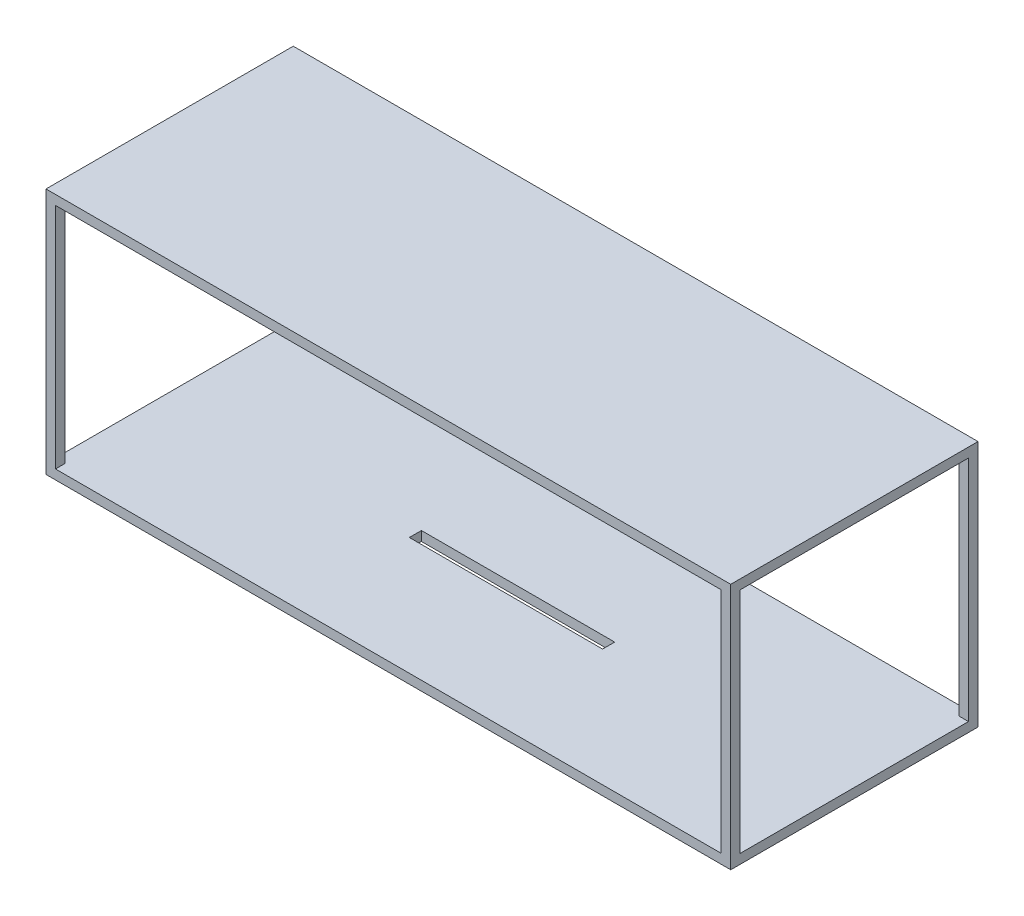
ISO-10303-21;
HEADER;
FILE_DESCRIPTION(('STEP AP214'),'2;1');
FILE_NAME('part.step','',(''),(''),'','','');
FILE_SCHEMA(('AUTOMOTIVE_DESIGN { 1 0 10303 214 1 1 1 1 }'));
ENDSEC;
DATA;
#1=APPLICATION_CONTEXT('core data for automotive mechanical design processes');
#2=APPLICATION_PROTOCOL_DEFINITION('international standard','automotive_design',2000,#1);
#3=PRODUCT_CONTEXT('',#1,'mechanical');
#4=PRODUCT('Part','Part','',(#3));
#5=PRODUCT_RELATED_PRODUCT_CATEGORY('part','',(#4));
#6=PRODUCT_DEFINITION_FORMATION('','',#4);
#7=PRODUCT_DEFINITION_CONTEXT('part definition',#1,'design');
#8=PRODUCT_DEFINITION('design','',#6,#7);
#9=PRODUCT_DEFINITION_SHAPE('','',#8);
#10=(LENGTH_UNIT() NAMED_UNIT(*) SI_UNIT(.MILLI.,.METRE.));
#11=(NAMED_UNIT(*) PLANE_ANGLE_UNIT() SI_UNIT($,.RADIAN.));
#12=(NAMED_UNIT(*) SI_UNIT($,.STERADIAN.) SOLID_ANGLE_UNIT());
#13=UNCERTAINTY_MEASURE_WITH_UNIT(LENGTH_MEASURE(1.E-05),#10,'distance_accuracy_value','');
#14=(GEOMETRIC_REPRESENTATION_CONTEXT(3) GLOBAL_UNCERTAINTY_ASSIGNED_CONTEXT((#13)) GLOBAL_UNIT_ASSIGNED_CONTEXT((#10,
#11,#12)) REPRESENTATION_CONTEXT('',''));
#15=CARTESIAN_POINT('',(0.,0.,0.));
#16=DIRECTION('',(0.,0.,1.));
#17=DIRECTION('',(1.,0.,0.));
#18=AXIS2_PLACEMENT_3D('',#15,#16,#17);
#19=CARTESIAN_POINT('',(0.,0.,125.));
#20=DIRECTION('',(0.,0.,1.));
#21=DIRECTION('',(1.,0.,0.));
#22=AXIS2_PLACEMENT_3D('',#19,#20,#21);
#23=PLANE('',#22);
#24=DIRECTION('',(1.,0.,0.));
#25=VECTOR('',#24,1.);
#26=CARTESIAN_POINT('',(-180.,-60.,125.));
#27=LINE('',#26,#25);
#28=CARTESIAN_POINT('',(175.,-60.,125.));
#29=VERTEX_POINT('',#28);
#30=CARTESIAN_POINT('',(180.,-60.,125.));
#31=VERTEX_POINT('',#30);
#32=EDGE_CURVE('E272',#29,#31,#27,.T.);
#33=ORIENTED_EDGE('',*,*,#32,.F.);
#34=DIRECTION('',(0.,1.,0.));
#35=VECTOR('',#34,1.);
#36=CARTESIAN_POINT('',(175.,0.,125.));
#37=LINE('',#36,#35);
#38=CARTESIAN_POINT('',(175.,60.,125.));
#39=VERTEX_POINT('',#38);
#40=EDGE_CURVE('E254',#29,#39,#37,.T.);
#41=ORIENTED_EDGE('',*,*,#40,.T.);
#42=DIRECTION('',(-1.,0.,0.));
#43=VECTOR('',#42,1.);
#44=CARTESIAN_POINT('',(-180.,60.,125.));
#45=LINE('',#44,#43);
#46=CARTESIAN_POINT('',(180.,60.,125.));
#47=VERTEX_POINT('',#46);
#48=EDGE_CURVE('E263',#47,#39,#45,.T.);
#49=ORIENTED_EDGE('',*,*,#48,.F.);
#50=DIRECTION('',(0.,1.,0.));
#51=VECTOR('',#50,1.);
#52=CARTESIAN_POINT('',(180.,65.,125.));
#53=LINE('',#52,#51);
#54=EDGE_CURVE('E276',#31,#47,#53,.T.);
#55=ORIENTED_EDGE('',*,*,#54,.F.);
#56=EDGE_LOOP('',(#33,#41,#49,#55));
#57=FACE_BOUND('',#56,.T.);
#58=ADVANCED_FACE('F42',(#57),#23,.F.);
#59=CARTESIAN_POINT('',(0.,0.,5.));
#60=DIRECTION('',(0.,0.,1.));
#61=DIRECTION('',(1.,0.,0.));
#62=AXIS2_PLACEMENT_3D('',#59,#60,#61);
#63=PLANE('',#62);
#64=DIRECTION('',(0.,1.,0.));
#65=VECTOR('',#64,1.);
#66=CARTESIAN_POINT('',(175.,0.,5.));
#67=LINE('',#66,#65);
#68=CARTESIAN_POINT('',(175.,-60.,5.));
#69=VERTEX_POINT('',#68);
#70=CARTESIAN_POINT('',(175.,60.,5.));
#71=VERTEX_POINT('',#70);
#72=EDGE_CURVE('E11',#69,#71,#67,.T.);
#73=ORIENTED_EDGE('',*,*,#72,.F.);
#74=DIRECTION('',(1.,0.,0.));
#75=VECTOR('',#74,1.);
#76=CARTESIAN_POINT('',(-180.,-60.,5.));
#77=LINE('',#76,#75);
#78=CARTESIAN_POINT('',(180.,-60.,5.));
#79=VERTEX_POINT('',#78);
#80=EDGE_CURVE('E277',#69,#79,#77,.T.);
#81=ORIENTED_EDGE('',*,*,#80,.T.);
#82=DIRECTION('',(0.,1.,0.));
#83=VECTOR('',#82,1.);
#84=CARTESIAN_POINT('',(180.,65.,5.));
#85=LINE('',#84,#83);
#86=CARTESIAN_POINT('',(180.,60.,5.));
#87=VERTEX_POINT('',#86);
#88=EDGE_CURVE('E257',#79,#87,#85,.T.);
#89=ORIENTED_EDGE('',*,*,#88,.T.);
#90=DIRECTION('',(-1.,0.,0.));
#91=VECTOR('',#90,1.);
#92=CARTESIAN_POINT('',(-180.,60.,5.));
#93=LINE('',#92,#91);
#94=EDGE_CURVE('E258',#87,#71,#93,.T.);
#95=ORIENTED_EDGE('',*,*,#94,.T.);
#96=EDGE_LOOP('',(#73,#81,#89,#95));
#97=FACE_BOUND('',#96,.T.);
#98=ADVANCED_FACE('F371',(#97),#63,.T.);
#99=CARTESIAN_POINT('',(180.,65.,130.));
#100=DIRECTION('',(-1.,0.,0.));
#101=DIRECTION('',(0.,-1.,0.));
#102=AXIS2_PLACEMENT_3D('',#99,#100,#101);
#103=PLANE('',#102);
#104=DIRECTION('',(0.,1.,0.));
#105=VECTOR('',#104,1.);
#106=CARTESIAN_POINT('',(180.,65.,0.));
#107=LINE('',#106,#105);
#108=CARTESIAN_POINT('',(180.,-65.,0.));
#109=VERTEX_POINT('',#108);
#110=CARTESIAN_POINT('',(180.,65.,0.));
#111=VERTEX_POINT('',#110);
#112=EDGE_CURVE('E290',#109,#111,#107,.T.);
#113=ORIENTED_EDGE('',*,*,#112,.T.);
#114=DIRECTION('',(0.,0.,-1.));
#115=VECTOR('',#114,1.);
#116=CARTESIAN_POINT('',(180.,65.,130.));
#117=LINE('',#116,#115);
#118=CARTESIAN_POINT('',(180.,65.,130.));
#119=VERTEX_POINT('',#118);
#120=EDGE_CURVE('E323',#119,#111,#117,.T.);
#121=ORIENTED_EDGE('',*,*,#120,.F.);
#122=DIRECTION('',(0.,1.,0.));
#123=VECTOR('',#122,1.);
#124=CARTESIAN_POINT('',(180.,65.,130.));
#125=LINE('',#124,#123);
#126=CARTESIAN_POINT('',(180.,-65.,130.));
#127=VERTEX_POINT('',#126);
#128=EDGE_CURVE('E297',#127,#119,#125,.T.);
#129=ORIENTED_EDGE('',*,*,#128,.F.);
#130=DIRECTION('',(0.,0.,-1.));
#131=VECTOR('',#130,1.);
#132=CARTESIAN_POINT('',(180.,-65.,130.));
#133=LINE('',#132,#131);
#134=EDGE_CURVE('E307',#127,#109,#133,.T.);
#135=ORIENTED_EDGE('',*,*,#134,.T.);
#136=EDGE_LOOP('',(#113,#121,#129,#135));
#137=FACE_BOUND('',#136,.T.);
#138=ORIENTED_EDGE('',*,*,#88,.F.);
#139=DIRECTION('',(0.,0.,-1.));
#140=VECTOR('',#139,1.);
#141=CARTESIAN_POINT('',(180.,-60.,130.));
#142=LINE('',#141,#140);
#143=EDGE_CURVE('E271',#31,#79,#142,.T.);
#144=ORIENTED_EDGE('',*,*,#143,.F.);
#145=ORIENTED_EDGE('',*,*,#54,.T.);
#146=DIRECTION('',(0.,0.,-1.));
#147=VECTOR('',#146,1.);
#148=CARTESIAN_POINT('',(180.,60.,130.));
#149=LINE('',#148,#147);
#150=EDGE_CURVE('E281',#47,#87,#149,.T.);
#151=ORIENTED_EDGE('',*,*,#150,.T.);
#152=EDGE_LOOP('',(#138,#144,#145,#151));
#153=FACE_BOUND('',#152,.T.);
#154=ADVANCED_FACE('F44',(#137,#153),#103,.F.);
#155=CARTESIAN_POINT('',(-180.,65.,130.));
#156=DIRECTION('',(1.,0.,0.));
#157=DIRECTION('',(0.,1.,0.));
#158=AXIS2_PLACEMENT_3D('',#155,#156,#157);
#159=PLANE('',#158);
#160=DIRECTION('',(0.,-1.,0.));
#161=VECTOR('',#160,1.);
#162=CARTESIAN_POINT('',(-180.,65.,0.));
#163=LINE('',#162,#161);
#164=CARTESIAN_POINT('',(-180.,65.,0.));
#165=VERTEX_POINT('',#164);
#166=CARTESIAN_POINT('',(-180.,-65.,0.));
#167=VERTEX_POINT('',#166);
#168=EDGE_CURVE('E312',#165,#167,#163,.T.);
#169=ORIENTED_EDGE('',*,*,#168,.T.);
#170=DIRECTION('',(0.,0.,-1.));
#171=VECTOR('',#170,1.);
#172=CARTESIAN_POINT('',(-180.,-65.,130.));
#173=LINE('',#172,#171);
#174=CARTESIAN_POINT('',(-180.,-65.,130.));
#175=VERTEX_POINT('',#174);
#176=EDGE_CURVE('E317',#175,#167,#173,.T.);
#177=ORIENTED_EDGE('',*,*,#176,.F.);
#178=DIRECTION('',(0.,-1.,0.));
#179=VECTOR('',#178,1.);
#180=CARTESIAN_POINT('',(-180.,65.,130.));
#181=LINE('',#180,#179);
#182=CARTESIAN_POINT('',(-180.,65.,130.));
#183=VERTEX_POINT('',#182);
#184=EDGE_CURVE('E303',#183,#175,#181,.T.);
#185=ORIENTED_EDGE('',*,*,#184,.F.);
#186=DIRECTION('',(0.,0.,-1.));
#187=VECTOR('',#186,1.);
#188=CARTESIAN_POINT('',(-180.,65.,130.));
#189=LINE('',#188,#187);
#190=EDGE_CURVE('E320',#183,#165,#189,.T.);
#191=ORIENTED_EDGE('',*,*,#190,.T.);
#192=EDGE_LOOP('',(#169,#177,#185,#191));
#193=FACE_BOUND('',#192,.T.);
#194=DIRECTION('',(0.,-1.,0.));
#195=VECTOR('',#194,1.);
#196=CARTESIAN_POINT('',(-180.,65.,5.));
#197=LINE('',#196,#195);
#198=CARTESIAN_POINT('',(-180.,60.,5.));
#199=VERTEX_POINT('',#198);
#200=CARTESIAN_POINT('',(-180.,-60.,5.));
#201=VERTEX_POINT('',#200);
#202=EDGE_CURVE('E261',#199,#201,#197,.T.);
#203=ORIENTED_EDGE('',*,*,#202,.F.);
#204=DIRECTION('',(0.,0.,-1.));
#205=VECTOR('',#204,1.);
#206=CARTESIAN_POINT('',(-180.,60.,130.));
#207=LINE('',#206,#205);
#208=CARTESIAN_POINT('',(-180.,60.,125.));
#209=VERTEX_POINT('',#208);
#210=EDGE_CURVE('E278',#209,#199,#207,.T.);
#211=ORIENTED_EDGE('',*,*,#210,.F.);
#212=DIRECTION('',(0.,-1.,0.));
#213=VECTOR('',#212,1.);
#214=CARTESIAN_POINT('',(-180.,65.,125.));
#215=LINE('',#214,#213);
#216=CARTESIAN_POINT('',(-180.,-60.,125.));
#217=VERTEX_POINT('',#216);
#218=EDGE_CURVE('E266',#209,#217,#215,.T.);
#219=ORIENTED_EDGE('',*,*,#218,.T.);
#220=DIRECTION('',(0.,0.,-1.));
#221=VECTOR('',#220,1.);
#222=CARTESIAN_POINT('',(-180.,-60.,130.));
#223=LINE('',#222,#221);
#224=EDGE_CURVE('E282',#217,#201,#223,.T.);
#225=ORIENTED_EDGE('',*,*,#224,.T.);
#226=EDGE_LOOP('',(#203,#211,#219,#225));
#227=FACE_BOUND('',#226,.T.);
#228=ADVANCED_FACE('F339',(#193,#227),#159,.F.);
#229=CARTESIAN_POINT('',(-180.,65.,130.));
#230=DIRECTION('',(0.,-1.,0.));
#231=DIRECTION('',(0.,0.,-1.));
#232=AXIS2_PLACEMENT_3D('',#229,#230,#231);
#233=PLANE('',#232);
#234=DIRECTION('',(-1.,0.,0.));
#235=VECTOR('',#234,1.);
#236=CARTESIAN_POINT('',(-180.,65.,0.));
#237=LINE('',#236,#235);
#238=EDGE_CURVE('E310',#111,#165,#237,.T.);
#239=ORIENTED_EDGE('',*,*,#238,.T.);
#240=ORIENTED_EDGE('',*,*,#190,.F.);
#241=DIRECTION('',(-1.,0.,0.));
#242=VECTOR('',#241,1.);
#243=CARTESIAN_POINT('',(-180.,65.,130.));
#244=LINE('',#243,#242);
#245=EDGE_CURVE('E300',#119,#183,#244,.T.);
#246=ORIENTED_EDGE('',*,*,#245,.F.);
#247=ORIENTED_EDGE('',*,*,#120,.T.);
#248=EDGE_LOOP('',(#239,#240,#246,#247));
#249=FACE_BOUND('',#248,.T.);
#250=ADVANCED_FACE('F394',(#249),#233,.F.);
#251=CARTESIAN_POINT('',(-180.,-65.,130.));
#252=DIRECTION('',(0.,1.,0.));
#253=DIRECTION('',(0.,0.,1.));
#254=AXIS2_PLACEMENT_3D('',#251,#252,#253);
#255=PLANE('',#254);
#256=DIRECTION('',(1.,0.,0.));
#257=VECTOR('',#256,1.);
#258=CARTESIAN_POINT('',(-50.7999999999999,-65.,68.175));
#259=LINE('',#258,#257);
#260=CARTESIAN_POINT('',(-50.7999999999999,-65.,68.175));
#261=VERTEX_POINT('',#260);
#262=CARTESIAN_POINT('',(50.8000000000001,-65.,68.175));
#263=VERTEX_POINT('',#262);
#264=EDGE_CURVE('E187',#261,#263,#259,.T.);
#265=ORIENTED_EDGE('',*,*,#264,.T.);
#266=DIRECTION('',(0.,0.,-1.));
#267=VECTOR('',#266,1.);
#268=CARTESIAN_POINT('',(50.8000000000001,-65.,61.825));
#269=LINE('',#268,#267);
#270=CARTESIAN_POINT('',(50.8000000000001,-65.,61.825));
#271=VERTEX_POINT('',#270);
#272=EDGE_CURVE('E181',#263,#271,#269,.T.);
#273=ORIENTED_EDGE('',*,*,#272,.T.);
#274=DIRECTION('',(-1.,0.,0.));
#275=VECTOR('',#274,1.);
#276=CARTESIAN_POINT('',(-50.7999999999999,-65.,61.825));
#277=LINE('',#276,#275);
#278=CARTESIAN_POINT('',(-50.7999999999999,-65.,61.825));
#279=VERTEX_POINT('',#278);
#280=EDGE_CURVE('E190',#271,#279,#277,.T.);
#281=ORIENTED_EDGE('',*,*,#280,.T.);
#282=DIRECTION('',(0.,0.,1.));
#283=VECTOR('',#282,1.);
#284=CARTESIAN_POINT('',(-50.7999999999999,-65.,61.825));
#285=LINE('',#284,#283);
#286=EDGE_CURVE('E57',#279,#261,#285,.T.);
#287=ORIENTED_EDGE('',*,*,#286,.T.);
#288=EDGE_LOOP('',(#265,#273,#281,#287));
#289=FACE_BOUND('',#288,.T.);
#290=DIRECTION('',(1.,0.,0.));
#291=VECTOR('',#290,1.);
#292=CARTESIAN_POINT('',(-180.,-65.,0.));
#293=LINE('',#292,#291);
#294=EDGE_CURVE('E301',#167,#109,#293,.T.);
#295=ORIENTED_EDGE('',*,*,#294,.T.);
#296=ORIENTED_EDGE('',*,*,#134,.F.);
#297=DIRECTION('',(1.,0.,0.));
#298=VECTOR('',#297,1.);
#299=CARTESIAN_POINT('',(-180.,-65.,130.));
#300=LINE('',#299,#298);
#301=EDGE_CURVE('E305',#175,#127,#300,.T.);
#302=ORIENTED_EDGE('',*,*,#301,.F.);
#303=ORIENTED_EDGE('',*,*,#176,.T.);
#304=EDGE_LOOP('',(#295,#296,#302,#303));
#305=FACE_BOUND('',#304,.T.);
#306=ADVANCED_FACE('F194',(#289,#305),#255,.F.);
#307=CARTESIAN_POINT('',(0.,0.,130.));
#308=DIRECTION('',(0.,0.,1.));
#309=DIRECTION('',(1.,0.,0.));
#310=AXIS2_PLACEMENT_3D('',#307,#308,#309);
#311=PLANE('',#310);
#312=DIRECTION('',(0.,1.,0.));
#313=VECTOR('',#312,1.);
#314=CARTESIAN_POINT('',(175.,60.,130.));
#315=LINE('',#314,#313);
#316=CARTESIAN_POINT('',(175.,-60.,130.));
#317=VERTEX_POINT('',#316);
#318=CARTESIAN_POINT('',(175.,60.,130.));
#319=VERTEX_POINT('',#318);
#320=EDGE_CURVE('E212',#317,#319,#315,.T.);
#321=ORIENTED_EDGE('',*,*,#320,.F.);
#322=DIRECTION('',(1.,0.,0.));
#323=VECTOR('',#322,1.);
#324=CARTESIAN_POINT('',(-175.,-60.,130.));
#325=LINE('',#324,#323);
#326=CARTESIAN_POINT('',(-175.,-60.,130.));
#327=VERTEX_POINT('',#326);
#328=EDGE_CURVE('E220',#327,#317,#325,.T.);
#329=ORIENTED_EDGE('',*,*,#328,.F.);
#330=DIRECTION('',(0.,-1.,0.));
#331=VECTOR('',#330,1.);
#332=CARTESIAN_POINT('',(-175.,60.,130.));
#333=LINE('',#332,#331);
#334=CARTESIAN_POINT('',(-175.,60.,130.));
#335=VERTEX_POINT('',#334);
#336=EDGE_CURVE('E234',#335,#327,#333,.T.);
#337=ORIENTED_EDGE('',*,*,#336,.F.);
#338=DIRECTION('',(-1.,0.,0.));
#339=VECTOR('',#338,1.);
#340=CARTESIAN_POINT('',(-175.,60.,130.));
#341=LINE('',#340,#339);
#342=EDGE_CURVE('E231',#319,#335,#341,.T.);
#343=ORIENTED_EDGE('',*,*,#342,.F.);
#344=EDGE_LOOP('',(#321,#329,#337,#343));
#345=FACE_BOUND('',#344,.T.);
#346=ORIENTED_EDGE('',*,*,#128,.T.);
#347=ORIENTED_EDGE('',*,*,#245,.T.);
#348=ORIENTED_EDGE('',*,*,#184,.T.);
#349=ORIENTED_EDGE('',*,*,#301,.T.);
#350=EDGE_LOOP('',(#346,#347,#348,#349));
#351=FACE_BOUND('',#350,.T.);
#352=ADVANCED_FACE('F355',(#345,#351),#311,.T.);
#353=CARTESIAN_POINT('',(0.,0.,0.));
#354=DIRECTION('',(0.,0.,1.));
#355=DIRECTION('',(1.,0.,0.));
#356=AXIS2_PLACEMENT_3D('',#353,#354,#355);
#357=PLANE('',#356);
#358=DIRECTION('',(1.,0.,0.));
#359=VECTOR('',#358,1.);
#360=CARTESIAN_POINT('',(-175.,-60.,0.));
#361=LINE('',#360,#359);
#362=CARTESIAN_POINT('',(-175.,-60.,0.));
#363=VERTEX_POINT('',#362);
#364=CARTESIAN_POINT('',(175.,-60.,0.));
#365=VERTEX_POINT('',#364);
#366=EDGE_CURVE('E226',#363,#365,#361,.T.);
#367=ORIENTED_EDGE('',*,*,#366,.T.);
#368=DIRECTION('',(0.,1.,0.));
#369=VECTOR('',#368,1.);
#370=CARTESIAN_POINT('',(175.,60.,0.));
#371=LINE('',#370,#369);
#372=CARTESIAN_POINT('',(175.,60.,0.));
#373=VERTEX_POINT('',#372);
#374=EDGE_CURVE('E216',#365,#373,#371,.T.);
#375=ORIENTED_EDGE('',*,*,#374,.T.);
#376=DIRECTION('',(-1.,0.,0.));
#377=VECTOR('',#376,1.);
#378=CARTESIAN_POINT('',(-175.,60.,0.));
#379=LINE('',#378,#377);
#380=CARTESIAN_POINT('',(-175.,60.,0.));
#381=VERTEX_POINT('',#380);
#382=EDGE_CURVE('E219',#373,#381,#379,.T.);
#383=ORIENTED_EDGE('',*,*,#382,.T.);
#384=DIRECTION('',(0.,-1.,0.));
#385=VECTOR('',#384,1.);
#386=CARTESIAN_POINT('',(-175.,60.,0.));
#387=LINE('',#386,#385);
#388=EDGE_CURVE('E223',#381,#363,#387,.T.);
#389=ORIENTED_EDGE('',*,*,#388,.T.);
#390=EDGE_LOOP('',(#367,#375,#383,#389));
#391=FACE_BOUND('',#390,.T.);
#392=ORIENTED_EDGE('',*,*,#112,.F.);
#393=ORIENTED_EDGE('',*,*,#294,.F.);
#394=ORIENTED_EDGE('',*,*,#168,.F.);
#395=ORIENTED_EDGE('',*,*,#238,.F.);
#396=EDGE_LOOP('',(#392,#393,#394,#395));
#397=FACE_BOUND('',#396,.T.);
#398=ADVANCED_FACE('F377',(#391,#397),#357,.F.);
#399=CARTESIAN_POINT('',(-180.,60.,130.));
#400=DIRECTION('',(0.,-1.,0.));
#401=DIRECTION('',(0.,0.,-1.));
#402=AXIS2_PLACEMENT_3D('',#399,#400,#401);
#403=PLANE('',#402);
#404=CARTESIAN_POINT('',(-175.,60.,5.));
#405=VERTEX_POINT('',#404);
#406=EDGE_CURVE('E262',#405,#199,#93,.T.);
#407=ORIENTED_EDGE('',*,*,#406,.F.);
#408=DIRECTION('',(0.,0.,1.));
#409=VECTOR('',#408,1.);
#410=CARTESIAN_POINT('',(-175.,60.,0.));
#411=LINE('',#410,#409);
#412=EDGE_CURVE('E247',#381,#405,#411,.T.);
#413=ORIENTED_EDGE('',*,*,#412,.F.);
#414=ORIENTED_EDGE('',*,*,#382,.F.);
#415=DIRECTION('',(0.,0.,1.));
#416=VECTOR('',#415,1.);
#417=CARTESIAN_POINT('',(175.,60.,0.));
#418=LINE('',#417,#416);
#419=EDGE_CURVE('E250',#373,#71,#418,.T.);
#420=ORIENTED_EDGE('',*,*,#419,.T.);
#421=ORIENTED_EDGE('',*,*,#94,.F.);
#422=ORIENTED_EDGE('',*,*,#150,.F.);
#423=ORIENTED_EDGE('',*,*,#48,.T.);
#424=EDGE_CURVE('E229',#39,#319,#418,.T.);
#425=ORIENTED_EDGE('',*,*,#424,.T.);
#426=ORIENTED_EDGE('',*,*,#342,.T.);
#427=CARTESIAN_POINT('',(-175.,60.,125.));
#428=VERTEX_POINT('',#427);
#429=EDGE_CURVE('E249',#428,#335,#411,.T.);
#430=ORIENTED_EDGE('',*,*,#429,.F.);
#431=EDGE_CURVE('E267',#428,#209,#45,.T.);
#432=ORIENTED_EDGE('',*,*,#431,.T.);
#433=ORIENTED_EDGE('',*,*,#210,.T.);
#434=EDGE_LOOP('',(#407,#413,#414,#420,#421,#422,#423,#425,#426,#430,#432,#433));
#435=FACE_BOUND('',#434,.T.);
#436=ADVANCED_FACE('F361',(#435),#403,.T.);
#437=CARTESIAN_POINT('',(-180.,-60.,130.));
#438=DIRECTION('',(0.,1.,0.));
#439=DIRECTION('',(0.,0.,1.));
#440=AXIS2_PLACEMENT_3D('',#437,#438,#439);
#441=PLANE('',#440);
#442=DIRECTION('',(0.,0.,-1.));
#443=VECTOR('',#442,1.);
#444=CARTESIAN_POINT('',(50.8000000000001,-60.,61.825));
#445=LINE('',#444,#443);
#446=CARTESIAN_POINT('',(50.8000000000001,-60.,68.175));
#447=VERTEX_POINT('',#446);
#448=CARTESIAN_POINT('',(50.8000000000001,-60.,61.825));
#449=VERTEX_POINT('',#448);
#450=EDGE_CURVE('E65',#447,#449,#445,.T.);
#451=ORIENTED_EDGE('',*,*,#450,.F.);
#452=DIRECTION('',(1.,0.,0.));
#453=VECTOR('',#452,1.);
#454=CARTESIAN_POINT('',(-50.7999999999999,-60.,68.175));
#455=LINE('',#454,#453);
#456=CARTESIAN_POINT('',(-50.7999999999999,-60.,68.175));
#457=VERTEX_POINT('',#456);
#458=EDGE_CURVE('E197',#457,#447,#455,.T.);
#459=ORIENTED_EDGE('',*,*,#458,.F.);
#460=DIRECTION('',(0.,0.,1.));
#461=VECTOR('',#460,1.);
#462=CARTESIAN_POINT('',(-50.7999999999999,-60.,61.825));
#463=LINE('',#462,#461);
#464=CARTESIAN_POINT('',(-50.7999999999999,-60.,61.825));
#465=VERTEX_POINT('',#464);
#466=EDGE_CURVE('E200',#465,#457,#463,.T.);
#467=ORIENTED_EDGE('',*,*,#466,.F.);
#468=DIRECTION('',(-1.,0.,0.));
#469=VECTOR('',#468,1.);
#470=CARTESIAN_POINT('',(-50.7999999999999,-60.,61.825));
#471=LINE('',#470,#469);
#472=EDGE_CURVE('E206',#449,#465,#471,.T.);
#473=ORIENTED_EDGE('',*,*,#472,.F.);
#474=EDGE_LOOP('',(#451,#459,#467,#473));
#475=FACE_BOUND('',#474,.T.);
#476=CARTESIAN_POINT('',(-175.,-60.,125.));
#477=VERTEX_POINT('',#476);
#478=EDGE_CURVE('E268',#217,#477,#27,.T.);
#479=ORIENTED_EDGE('',*,*,#478,.T.);
#480=DIRECTION('',(0.,0.,1.));
#481=VECTOR('',#480,1.);
#482=CARTESIAN_POINT('',(-175.,-60.,0.));
#483=LINE('',#482,#481);
#484=EDGE_CURVE('E246',#477,#327,#483,.T.);
#485=ORIENTED_EDGE('',*,*,#484,.T.);
#486=ORIENTED_EDGE('',*,*,#328,.T.);
#487=DIRECTION('',(0.,0.,1.));
#488=VECTOR('',#487,1.);
#489=CARTESIAN_POINT('',(175.,-60.,0.));
#490=LINE('',#489,#488);
#491=EDGE_CURVE('E242',#29,#317,#490,.T.);
#492=ORIENTED_EDGE('',*,*,#491,.F.);
#493=ORIENTED_EDGE('',*,*,#32,.T.);
#494=ORIENTED_EDGE('',*,*,#143,.T.);
#495=ORIENTED_EDGE('',*,*,#80,.F.);
#496=EDGE_CURVE('E239',#365,#69,#490,.T.);
#497=ORIENTED_EDGE('',*,*,#496,.F.);
#498=ORIENTED_EDGE('',*,*,#366,.F.);
#499=CARTESIAN_POINT('',(-175.,-60.,5.));
#500=VERTEX_POINT('',#499);
#501=EDGE_CURVE('E243',#363,#500,#483,.T.);
#502=ORIENTED_EDGE('',*,*,#501,.T.);
#503=EDGE_CURVE('E273',#201,#500,#77,.T.);
#504=ORIENTED_EDGE('',*,*,#503,.F.);
#505=ORIENTED_EDGE('',*,*,#224,.F.);
#506=EDGE_LOOP('',(#479,#485,#486,#492,#493,#494,#495,#497,#498,#502,#504,#505));
#507=FACE_BOUND('',#506,.T.);
#508=ADVANCED_FACE('F334',(#475,#507),#441,.T.);
#509=ORIENTED_EDGE('',*,*,#431,.F.);
#510=DIRECTION('',(0.,-1.,0.));
#511=VECTOR('',#510,1.);
#512=CARTESIAN_POINT('',(-175.,0.,125.));
#513=LINE('',#512,#511);
#514=EDGE_CURVE('E241',#428,#477,#513,.T.);
#515=ORIENTED_EDGE('',*,*,#514,.T.);
#516=ORIENTED_EDGE('',*,*,#478,.F.);
#517=ORIENTED_EDGE('',*,*,#218,.F.);
#518=EDGE_LOOP('',(#509,#515,#516,#517));
#519=FACE_BOUND('',#518,.T.);
#520=ADVANCED_FACE('F344',(#519),#23,.F.);
#521=DIRECTION('',(0.,-1.,0.));
#522=VECTOR('',#521,1.);
#523=CARTESIAN_POINT('',(-175.,0.,5.));
#524=LINE('',#523,#522);
#525=EDGE_CURVE('E50',#405,#500,#524,.T.);
#526=ORIENTED_EDGE('',*,*,#525,.F.);
#527=ORIENTED_EDGE('',*,*,#406,.T.);
#528=ORIENTED_EDGE('',*,*,#202,.T.);
#529=ORIENTED_EDGE('',*,*,#503,.T.);
#530=EDGE_LOOP('',(#526,#527,#528,#529));
#531=FACE_BOUND('',#530,.T.);
#532=ADVANCED_FACE('F335',(#531),#63,.T.);
#533=CARTESIAN_POINT('',(-175.,60.,0.));
#534=DIRECTION('',(-1.,0.,0.));
#535=DIRECTION('',(0.,0.,1.));
#536=AXIS2_PLACEMENT_3D('',#533,#534,#535);
#537=PLANE('',#536);
#538=ORIENTED_EDGE('',*,*,#525,.T.);
#539=ORIENTED_EDGE('',*,*,#501,.F.);
#540=ORIENTED_EDGE('',*,*,#388,.F.);
#541=ORIENTED_EDGE('',*,*,#412,.T.);
#542=EDGE_LOOP('',(#538,#539,#540,#541));
#543=FACE_BOUND('',#542,.T.);
#544=ADVANCED_FACE('F327',(#543),#537,.F.);
#545=CARTESIAN_POINT('',(175.,60.,0.));
#546=DIRECTION('',(1.,0.,0.));
#547=DIRECTION('',(0.,0.,-1.));
#548=AXIS2_PLACEMENT_3D('',#545,#546,#547);
#549=PLANE('',#548);
#550=ORIENTED_EDGE('',*,*,#72,.T.);
#551=ORIENTED_EDGE('',*,*,#419,.F.);
#552=ORIENTED_EDGE('',*,*,#374,.F.);
#553=ORIENTED_EDGE('',*,*,#496,.T.);
#554=EDGE_LOOP('',(#550,#551,#552,#553));
#555=FACE_BOUND('',#554,.T.);
#556=ADVANCED_FACE('F373',(#555),#549,.F.);
#557=ORIENTED_EDGE('',*,*,#491,.T.);
#558=ORIENTED_EDGE('',*,*,#320,.T.);
#559=ORIENTED_EDGE('',*,*,#424,.F.);
#560=ORIENTED_EDGE('',*,*,#40,.F.);
#561=EDGE_LOOP('',(#557,#558,#559,#560));
#562=FACE_BOUND('',#561,.T.);
#563=ADVANCED_FACE('F359',(#562),#549,.F.);
#564=ORIENTED_EDGE('',*,*,#429,.T.);
#565=ORIENTED_EDGE('',*,*,#336,.T.);
#566=ORIENTED_EDGE('',*,*,#484,.F.);
#567=ORIENTED_EDGE('',*,*,#514,.F.);
#568=EDGE_LOOP('',(#564,#565,#566,#567));
#569=FACE_BOUND('',#568,.T.);
#570=ADVANCED_FACE('F347',(#569),#537,.F.);
#571=CARTESIAN_POINT('',(50.8000000000001,-65.,61.825));
#572=DIRECTION('',(1.,0.,0.));
#573=DIRECTION('',(0.,0.,-1.));
#574=AXIS2_PLACEMENT_3D('',#571,#572,#573);
#575=PLANE('',#574);
#576=ORIENTED_EDGE('',*,*,#450,.T.);
#577=DIRECTION('',(0.,1.,0.));
#578=VECTOR('',#577,1.);
#579=CARTESIAN_POINT('',(50.8000000000001,-65.,61.825));
#580=LINE('',#579,#578);
#581=EDGE_CURVE('E177',#271,#449,#580,.T.);
#582=ORIENTED_EDGE('',*,*,#581,.F.);
#583=ORIENTED_EDGE('',*,*,#272,.F.);
#584=DIRECTION('',(0.,1.,0.));
#585=VECTOR('',#584,1.);
#586=CARTESIAN_POINT('',(50.8000000000001,-65.,68.175));
#587=LINE('',#586,#585);
#588=EDGE_CURVE('E210',#263,#447,#587,.T.);
#589=ORIENTED_EDGE('',*,*,#588,.T.);
#590=EDGE_LOOP('',(#576,#582,#583,#589));
#591=FACE_BOUND('',#590,.T.);
#592=ADVANCED_FACE('F179',(#591),#575,.F.);
#593=CARTESIAN_POINT('',(-50.7999999999999,-65.,68.175));
#594=DIRECTION('',(0.,0.,1.));
#595=DIRECTION('',(1.,0.,0.));
#596=AXIS2_PLACEMENT_3D('',#593,#594,#595);
#597=PLANE('',#596);
#598=ORIENTED_EDGE('',*,*,#458,.T.);
#599=ORIENTED_EDGE('',*,*,#588,.F.);
#600=ORIENTED_EDGE('',*,*,#264,.F.);
#601=DIRECTION('',(0.,1.,0.));
#602=VECTOR('',#601,1.);
#603=CARTESIAN_POINT('',(-50.7999999999999,-65.,68.175));
#604=LINE('',#603,#602);
#605=EDGE_CURVE('E213',#261,#457,#604,.T.);
#606=ORIENTED_EDGE('',*,*,#605,.T.);
#607=EDGE_LOOP('',(#598,#599,#600,#606));
#608=FACE_BOUND('',#607,.T.);
#609=ADVANCED_FACE('F426',(#608),#597,.F.);
#610=CARTESIAN_POINT('',(-50.7999999999999,-65.,61.825));
#611=DIRECTION('',(-1.,0.,0.));
#612=DIRECTION('',(0.,0.,1.));
#613=AXIS2_PLACEMENT_3D('',#610,#611,#612);
#614=PLANE('',#613);
#615=ORIENTED_EDGE('',*,*,#466,.T.);
#616=ORIENTED_EDGE('',*,*,#605,.F.);
#617=ORIENTED_EDGE('',*,*,#286,.F.);
#618=DIRECTION('',(0.,1.,0.));
#619=VECTOR('',#618,1.);
#620=CARTESIAN_POINT('',(-50.7999999999999,-65.,61.825));
#621=LINE('',#620,#619);
#622=EDGE_CURVE('E186',#279,#465,#621,.T.);
#623=ORIENTED_EDGE('',*,*,#622,.T.);
#624=EDGE_LOOP('',(#615,#616,#617,#623));
#625=FACE_BOUND('',#624,.T.);
#626=ADVANCED_FACE('F429',(#625),#614,.F.);
#627=CARTESIAN_POINT('',(-50.7999999999999,-65.,61.825));
#628=DIRECTION('',(0.,0.,-1.));
#629=DIRECTION('',(-1.,0.,0.));
#630=AXIS2_PLACEMENT_3D('',#627,#628,#629);
#631=PLANE('',#630);
#632=ORIENTED_EDGE('',*,*,#472,.T.);
#633=ORIENTED_EDGE('',*,*,#622,.F.);
#634=ORIENTED_EDGE('',*,*,#280,.F.);
#635=ORIENTED_EDGE('',*,*,#581,.T.);
#636=EDGE_LOOP('',(#632,#633,#634,#635));
#637=FACE_BOUND('',#636,.T.);
#638=ADVANCED_FACE('F191',(#637),#631,.F.);
#639=CLOSED_SHELL('',(#58,#98,#154,#228,#250,#306,#352,#398,#436,#508,#520,#532,#544,#556,#563,
#570,#592,#609,#626,#638));
#640=MANIFOLD_SOLID_BREP('B2',#639);
#641=ADVANCED_BREP_SHAPE_REPRESENTATION('',(#18,#640),#14);
#642=SHAPE_DEFINITION_REPRESENTATION(#9,#641);
ENDSEC;
END-ISO-10303-21;
